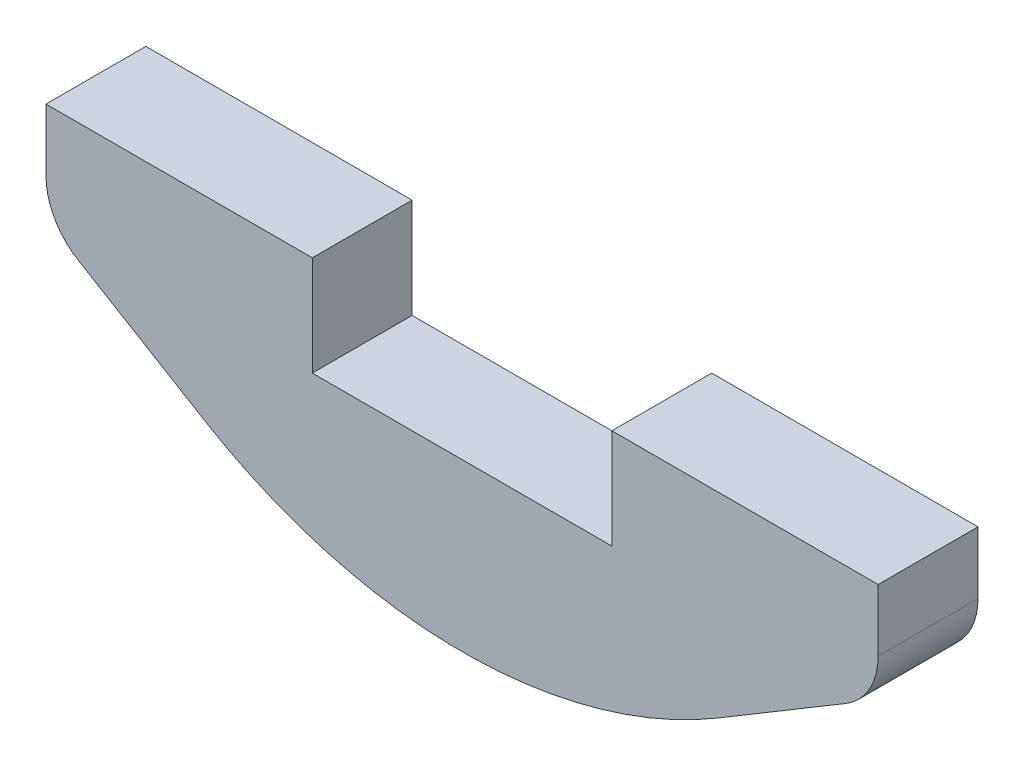
ISO-10303-21;
HEADER;
FILE_DESCRIPTION(('STEP AP214'),'2;1');
FILE_NAME('part.step','',(''),(''),'','','');
FILE_SCHEMA(('AUTOMOTIVE_DESIGN { 1 0 10303 214 1 1 1 1 }'));
ENDSEC;
DATA;
#1=APPLICATION_CONTEXT('core data for automotive mechanical design processes');
#2=APPLICATION_PROTOCOL_DEFINITION('international standard','automotive_design',2000,#1);
#3=PRODUCT_CONTEXT('',#1,'mechanical');
#4=PRODUCT('Part','Part','',(#3));
#5=PRODUCT_RELATED_PRODUCT_CATEGORY('part','',(#4));
#6=PRODUCT_DEFINITION_FORMATION('','',#4);
#7=PRODUCT_DEFINITION_CONTEXT('part definition',#1,'design');
#8=PRODUCT_DEFINITION('design','',#6,#7);
#9=PRODUCT_DEFINITION_SHAPE('','',#8);
#10=(LENGTH_UNIT() NAMED_UNIT(*) SI_UNIT(.MILLI.,.METRE.));
#11=(NAMED_UNIT(*) PLANE_ANGLE_UNIT() SI_UNIT($,.RADIAN.));
#12=(NAMED_UNIT(*) SI_UNIT($,.STERADIAN.) SOLID_ANGLE_UNIT());
#13=UNCERTAINTY_MEASURE_WITH_UNIT(LENGTH_MEASURE(1.E-05),#10,'distance_accuracy_value','');
#14=(GEOMETRIC_REPRESENTATION_CONTEXT(3) GLOBAL_UNCERTAINTY_ASSIGNED_CONTEXT((#13)) GLOBAL_UNIT_ASSIGNED_CONTEXT((#10,
#11,#12)) REPRESENTATION_CONTEXT('',''));
#15=CARTESIAN_POINT('',(0.,0.,0.));
#16=DIRECTION('',(0.,0.,1.));
#17=DIRECTION('',(1.,0.,0.));
#18=AXIS2_PLACEMENT_3D('',#15,#16,#17);
#19=CARTESIAN_POINT('',(-3.29672579863213,-5.50823669530776,3.));
#20=DIRECTION('',(0.513554343658557,0.858057070426804,0.));
#21=DIRECTION('',(-0.858057070426804,0.513554343658557,0.));
#22=AXIS2_PLACEMENT_3D('',#19,#20,#21);
#23=PLANE('',#22);
#24=DIRECTION('',(0.858057070426804,-0.513554343658557,0.));
#25=VECTOR('',#24,1.);
#26=CARTESIAN_POINT('',(-3.29672579863213,-5.50823669530776,3.));
#27=LINE('',#26,#25);
#28=CARTESIAN_POINT('',(-11.5271086873171,-0.582283599490007,3.));
#29=VERTEX_POINT('',#28);
#30=CARTESIAN_POINT('',(-7.70331515487836,-2.87085605640205,3.));
#31=VERTEX_POINT('',#30);
#32=EDGE_CURVE('E121',#29,#31,#27,.T.);
#33=ORIENTED_EDGE('',*,*,#32,.F.);
#34=DIRECTION('',(0.,0.,-1.));
#35=VECTOR('',#34,1.);
#36=CARTESIAN_POINT('',(-11.5271086873171,-0.582283599490008,0.));
#37=LINE('',#36,#35);
#38=CARTESIAN_POINT('',(-11.5271086873171,-0.582283599490007,0.));
#39=VERTEX_POINT('',#38);
#40=EDGE_CURVE('E43',#29,#39,#37,.T.);
#41=ORIENTED_EDGE('',*,*,#40,.T.);
#42=DIRECTION('',(0.858057070426804,-0.513554343658557,0.));
#43=VECTOR('',#42,1.);
#44=CARTESIAN_POINT('',(-3.29672579863213,-5.50823669530776,0.));
#45=LINE('',#44,#43);
#46=CARTESIAN_POINT('',(-7.70331515487836,-2.87085605640205,0.));
#47=VERTEX_POINT('',#46);
#48=EDGE_CURVE('E143',#39,#47,#45,.T.);
#49=ORIENTED_EDGE('',*,*,#48,.T.);
#50=DIRECTION('',(0.,0.,-1.));
#51=VECTOR('',#50,1.);
#52=CARTESIAN_POINT('',(-7.70331515487836,-2.87085605640205,3.));
#53=LINE('',#52,#51);
#54=EDGE_CURVE('E137',#31,#47,#53,.T.);
#55=ORIENTED_EDGE('',*,*,#54,.F.);
#56=EDGE_LOOP('',(#33,#41,#49,#55));
#57=FACE_BOUND('',#56,.T.);
#58=ADVANCED_FACE('F35',(#57),#23,.F.);
#59=CARTESIAN_POINT('',(0.,10.,3.));
#60=DIRECTION('',(0.,0.,-1.));
#61=DIRECTION('',(-1.,0.,0.));
#62=AXIS2_PLACEMENT_3D('',#59,#60,#61);
#63=CYLINDRICAL_SURFACE('',#62,15.);
#64=CARTESIAN_POINT('',(0.,10.,0.));
#65=DIRECTION('',(0.,0.,1.));
#66=DIRECTION('',(1.,0.,0.));
#67=AXIS2_PLACEMENT_3D('',#64,#65,#66);
#68=CIRCLE('',#67,15.);
#69=CARTESIAN_POINT('',(7.70331515487836,-2.87085605640205,0.));
#70=VERTEX_POINT('',#69);
#71=EDGE_CURVE('E165',#47,#70,#68,.T.);
#72=ORIENTED_EDGE('',*,*,#71,.T.);
#73=DIRECTION('',(0.,0.,-1.));
#74=VECTOR('',#73,1.);
#75=CARTESIAN_POINT('',(7.70331515487836,-2.87085605640205,3.));
#76=LINE('',#75,#74);
#77=CARTESIAN_POINT('',(7.70331515487836,-2.87085605640205,3.));
#78=VERTEX_POINT('',#77);
#79=EDGE_CURVE('E139',#78,#70,#76,.T.);
#80=ORIENTED_EDGE('',*,*,#79,.F.);
#81=CARTESIAN_POINT('',(0.,10.,3.));
#82=DIRECTION('',(0.,0.,1.));
#83=DIRECTION('',(1.,0.,0.));
#84=AXIS2_PLACEMENT_3D('',#81,#82,#83);
#85=CIRCLE('',#84,15.);
#86=EDGE_CURVE('E125',#31,#78,#85,.T.);
#87=ORIENTED_EDGE('',*,*,#86,.F.);
#88=ORIENTED_EDGE('',*,*,#54,.T.);
#89=EDGE_LOOP('',(#72,#80,#87,#88));
#90=FACE_BOUND('',#89,.T.);
#91=ADVANCED_FACE('F136',(#90),#63,.T.);
#92=CARTESIAN_POINT('',(3.29672579863213,-5.50823669530776,3.));
#93=DIRECTION('',(0.513554343658556,-0.858057070426804,0.));
#94=DIRECTION('',(0.858057070426804,0.513554343658556,0.));
#95=AXIS2_PLACEMENT_3D('',#92,#93,#94);
#96=PLANE('',#95);
#97=DIRECTION('',(-0.858057070426804,-0.513554343658556,0.));
#98=VECTOR('',#97,1.);
#99=CARTESIAN_POINT('',(3.29672579863213,-5.50823669530776,0.));
#100=LINE('',#99,#98);
#101=CARTESIAN_POINT('',(11.5271086873171,-0.582283599490009,0.));
#102=VERTEX_POINT('',#101);
#103=EDGE_CURVE('E167',#102,#70,#100,.T.);
#104=ORIENTED_EDGE('',*,*,#103,.F.);
#105=DIRECTION('',(0.,0.,-1.));
#106=VECTOR('',#105,1.);
#107=CARTESIAN_POINT('',(11.5271086873171,-0.582283599490009,3.));
#108=LINE('',#107,#106);
#109=CARTESIAN_POINT('',(11.5271086873171,-0.582283599490009,3.));
#110=VERTEX_POINT('',#109);
#111=EDGE_CURVE('E157',#102,#110,#108,.F.);
#112=ORIENTED_EDGE('',*,*,#111,.T.);
#113=DIRECTION('',(-0.858057070426804,-0.513554343658556,0.));
#114=VECTOR('',#113,1.);
#115=CARTESIAN_POINT('',(3.29672579863213,-5.50823669530776,3.));
#116=LINE('',#115,#114);
#117=EDGE_CURVE('E140',#110,#78,#116,.T.);
#118=ORIENTED_EDGE('',*,*,#117,.T.);
#119=ORIENTED_EDGE('',*,*,#79,.T.);
#120=EDGE_LOOP('',(#104,#112,#118,#119));
#121=FACE_BOUND('',#120,.T.);
#122=ADVANCED_FACE('F253',(#121),#96,.T.);
#123=CARTESIAN_POINT('',(12.5,0.,3.));
#124=DIRECTION('',(-1.,0.,0.));
#125=DIRECTION('',(0.,0.,1.));
#126=AXIS2_PLACEMENT_3D('',#123,#124,#125);
#127=PLANE('',#126);
#128=DIRECTION('',(0.,1.,0.));
#129=VECTOR('',#128,1.);
#130=CARTESIAN_POINT('',(12.5,0.,3.));
#131=LINE('',#130,#129);
#132=CARTESIAN_POINT('',(12.5,1.1338305413636,3.));
#133=VERTEX_POINT('',#132);
#134=CARTESIAN_POINT('',(12.5,3.,3.));
#135=VERTEX_POINT('',#134);
#136=EDGE_CURVE('E226',#133,#135,#131,.T.);
#137=ORIENTED_EDGE('',*,*,#136,.F.);
#138=DIRECTION('',(0.,0.,-1.));
#139=VECTOR('',#138,1.);
#140=CARTESIAN_POINT('',(12.5,1.1338305413636,0.));
#141=LINE('',#140,#139);
#142=CARTESIAN_POINT('',(12.5,1.1338305413636,0.));
#143=VERTEX_POINT('',#142);
#144=EDGE_CURVE('E145',#133,#143,#141,.T.);
#145=ORIENTED_EDGE('',*,*,#144,.T.);
#146=DIRECTION('',(0.,1.,0.));
#147=VECTOR('',#146,1.);
#148=CARTESIAN_POINT('',(12.5,0.,0.));
#149=LINE('',#148,#147);
#150=CARTESIAN_POINT('',(12.5,3.,0.));
#151=VERTEX_POINT('',#150);
#152=EDGE_CURVE('E174',#143,#151,#149,.T.);
#153=ORIENTED_EDGE('',*,*,#152,.T.);
#154=DIRECTION('',(0.,0.,-1.));
#155=VECTOR('',#154,1.);
#156=CARTESIAN_POINT('',(12.5,3.,3.));
#157=LINE('',#156,#155);
#158=EDGE_CURVE('E150',#135,#151,#157,.T.);
#159=ORIENTED_EDGE('',*,*,#158,.F.);
#160=EDGE_LOOP('',(#137,#145,#153,#159));
#161=FACE_BOUND('',#160,.T.);
#162=ADVANCED_FACE('F258',(#161),#127,.F.);
#163=CARTESIAN_POINT('',(0.,3.,3.));
#164=DIRECTION('',(0.,-1.,0.));
#165=DIRECTION('',(1.,0.,0.));
#166=AXIS2_PLACEMENT_3D('',#163,#164,#165);
#167=PLANE('',#166);
#168=DIRECTION('',(-1.,0.,0.));
#169=VECTOR('',#168,1.);
#170=CARTESIAN_POINT('',(0.,3.,0.));
#171=LINE('',#170,#169);
#172=CARTESIAN_POINT('',(4.5,3.,0.));
#173=VERTEX_POINT('',#172);
#174=EDGE_CURVE('E176',#151,#173,#171,.T.);
#175=ORIENTED_EDGE('',*,*,#174,.T.);
#176=DIRECTION('',(0.,0.,-1.));
#177=VECTOR('',#176,1.);
#178=CARTESIAN_POINT('',(4.5,3.,3.));
#179=LINE('',#178,#177);
#180=CARTESIAN_POINT('',(4.5,3.,3.));
#181=VERTEX_POINT('',#180);
#182=EDGE_CURVE('E201',#181,#173,#179,.T.);
#183=ORIENTED_EDGE('',*,*,#182,.F.);
#184=DIRECTION('',(-1.,0.,0.));
#185=VECTOR('',#184,1.);
#186=CARTESIAN_POINT('',(0.,3.,3.));
#187=LINE('',#186,#185);
#188=EDGE_CURVE('E209',#135,#181,#187,.T.);
#189=ORIENTED_EDGE('',*,*,#188,.F.);
#190=ORIENTED_EDGE('',*,*,#158,.T.);
#191=EDGE_LOOP('',(#175,#183,#189,#190));
#192=FACE_BOUND('',#191,.T.);
#193=ADVANCED_FACE('F207',(#192),#167,.F.);
#194=CARTESIAN_POINT('',(4.5,0.,3.));
#195=DIRECTION('',(-1.,0.,0.));
#196=DIRECTION('',(0.,0.,1.));
#197=AXIS2_PLACEMENT_3D('',#194,#195,#196);
#198=PLANE('',#197);
#199=DIRECTION('',(0.,1.,0.));
#200=VECTOR('',#199,1.);
#201=CARTESIAN_POINT('',(4.5,0.,0.));
#202=LINE('',#201,#200);
#203=CARTESIAN_POINT('',(4.5,0.,0.));
#204=VERTEX_POINT('',#203);
#205=EDGE_CURVE('E179',#204,#173,#202,.T.);
#206=ORIENTED_EDGE('',*,*,#205,.F.);
#207=DIRECTION('',(0.,0.,-1.));
#208=VECTOR('',#207,1.);
#209=CARTESIAN_POINT('',(4.5,0.,3.));
#210=LINE('',#209,#208);
#211=CARTESIAN_POINT('',(4.5,0.,3.));
#212=VERTEX_POINT('',#211);
#213=EDGE_CURVE('E199',#212,#204,#210,.T.);
#214=ORIENTED_EDGE('',*,*,#213,.F.);
#215=DIRECTION('',(0.,1.,0.));
#216=VECTOR('',#215,1.);
#217=CARTESIAN_POINT('',(4.5,0.,3.));
#218=LINE('',#217,#216);
#219=EDGE_CURVE('E219',#212,#181,#218,.T.);
#220=ORIENTED_EDGE('',*,*,#219,.T.);
#221=ORIENTED_EDGE('',*,*,#182,.T.);
#222=EDGE_LOOP('',(#206,#214,#220,#221));
#223=FACE_BOUND('',#222,.T.);
#224=ADVANCED_FACE('F216',(#223),#198,.T.);
#225=CARTESIAN_POINT('',(0.,0.,3.));
#226=DIRECTION('',(0.,1.,0.));
#227=DIRECTION('',(0.,0.,1.));
#228=AXIS2_PLACEMENT_3D('',#225,#226,#227);
#229=PLANE('',#228);
#230=DIRECTION('',(1.,0.,0.));
#231=VECTOR('',#230,1.);
#232=CARTESIAN_POINT('',(0.,0.,0.));
#233=LINE('',#232,#231);
#234=CARTESIAN_POINT('',(-4.5,0.,0.));
#235=VERTEX_POINT('',#234);
#236=EDGE_CURVE('E182',#235,#204,#233,.T.);
#237=ORIENTED_EDGE('',*,*,#236,.F.);
#238=DIRECTION('',(0.,0.,-1.));
#239=VECTOR('',#238,1.);
#240=CARTESIAN_POINT('',(-4.5,0.,3.));
#241=LINE('',#240,#239);
#242=CARTESIAN_POINT('',(-4.5,0.,3.));
#243=VERTEX_POINT('',#242);
#244=EDGE_CURVE('E197',#243,#235,#241,.T.);
#245=ORIENTED_EDGE('',*,*,#244,.F.);
#246=DIRECTION('',(1.,0.,0.));
#247=VECTOR('',#246,1.);
#248=CARTESIAN_POINT('',(0.,0.,3.));
#249=LINE('',#248,#247);
#250=EDGE_CURVE('E222',#243,#212,#249,.T.);
#251=ORIENTED_EDGE('',*,*,#250,.T.);
#252=ORIENTED_EDGE('',*,*,#213,.T.);
#253=EDGE_LOOP('',(#237,#245,#251,#252));
#254=FACE_BOUND('',#253,.T.);
#255=ADVANCED_FACE('F266',(#254),#229,.T.);
#256=CARTESIAN_POINT('',(-4.5,0.,3.));
#257=DIRECTION('',(-1.,0.,0.));
#258=DIRECTION('',(0.,0.,1.));
#259=AXIS2_PLACEMENT_3D('',#256,#257,#258);
#260=PLANE('',#259);
#261=DIRECTION('',(0.,1.,0.));
#262=VECTOR('',#261,1.);
#263=CARTESIAN_POINT('',(-4.5,0.,0.));
#264=LINE('',#263,#262);
#265=CARTESIAN_POINT('',(-4.5,3.,0.));
#266=VERTEX_POINT('',#265);
#267=EDGE_CURVE('E185',#235,#266,#264,.T.);
#268=ORIENTED_EDGE('',*,*,#267,.T.);
#269=DIRECTION('',(0.,0.,-1.));
#270=VECTOR('',#269,1.);
#271=CARTESIAN_POINT('',(-4.5,3.,3.));
#272=LINE('',#271,#270);
#273=CARTESIAN_POINT('',(-4.5,3.,3.));
#274=VERTEX_POINT('',#273);
#275=EDGE_CURVE('E195',#274,#266,#272,.T.);
#276=ORIENTED_EDGE('',*,*,#275,.F.);
#277=DIRECTION('',(0.,1.,0.));
#278=VECTOR('',#277,1.);
#279=CARTESIAN_POINT('',(-4.5,0.,3.));
#280=LINE('',#279,#278);
#281=EDGE_CURVE('E224',#243,#274,#280,.T.);
#282=ORIENTED_EDGE('',*,*,#281,.F.);
#283=ORIENTED_EDGE('',*,*,#244,.T.);
#284=EDGE_LOOP('',(#268,#276,#282,#283));
#285=FACE_BOUND('',#284,.T.);
#286=ADVANCED_FACE('F241',(#285),#260,.F.);
#287=CARTESIAN_POINT('',(0.,3.,3.));
#288=DIRECTION('',(0.,1.,0.));
#289=DIRECTION('',(0.,0.,1.));
#290=AXIS2_PLACEMENT_3D('',#287,#288,#289);
#291=PLANE('',#290);
#292=DIRECTION('',(1.,0.,0.));
#293=VECTOR('',#292,1.);
#294=CARTESIAN_POINT('',(0.,3.,0.));
#295=LINE('',#294,#293);
#296=CARTESIAN_POINT('',(-12.5,3.,0.));
#297=VERTEX_POINT('',#296);
#298=EDGE_CURVE('E188',#297,#266,#295,.T.);
#299=ORIENTED_EDGE('',*,*,#298,.F.);
#300=DIRECTION('',(0.,0.,-1.));
#301=VECTOR('',#300,1.);
#302=CARTESIAN_POINT('',(-12.5,3.,3.));
#303=LINE('',#302,#301);
#304=CARTESIAN_POINT('',(-12.5,3.,3.));
#305=VERTEX_POINT('',#304);
#306=EDGE_CURVE('E192',#305,#297,#303,.T.);
#307=ORIENTED_EDGE('',*,*,#306,.F.);
#308=DIRECTION('',(1.,0.,0.));
#309=VECTOR('',#308,1.);
#310=CARTESIAN_POINT('',(0.,3.,3.));
#311=LINE('',#310,#309);
#312=EDGE_CURVE('E230',#305,#274,#311,.T.);
#313=ORIENTED_EDGE('',*,*,#312,.T.);
#314=ORIENTED_EDGE('',*,*,#275,.T.);
#315=EDGE_LOOP('',(#299,#307,#313,#314));
#316=FACE_BOUND('',#315,.T.);
#317=ADVANCED_FACE('F237',(#316),#291,.T.);
#318=CARTESIAN_POINT('',(-12.5,0.,3.));
#319=DIRECTION('',(-1.,0.,0.));
#320=DIRECTION('',(0.,0.,1.));
#321=AXIS2_PLACEMENT_3D('',#318,#319,#320);
#322=PLANE('',#321);
#323=DIRECTION('',(0.,1.,0.));
#324=VECTOR('',#323,1.);
#325=CARTESIAN_POINT('',(-12.5,0.,0.));
#326=LINE('',#325,#324);
#327=CARTESIAN_POINT('',(-12.5,1.1338305413636,0.));
#328=VERTEX_POINT('',#327);
#329=EDGE_CURVE('E131',#328,#297,#326,.T.);
#330=ORIENTED_EDGE('',*,*,#329,.F.);
#331=DIRECTION('',(0.,0.,-1.));
#332=VECTOR('',#331,1.);
#333=CARTESIAN_POINT('',(-12.5,1.1338305413636,3.));
#334=LINE('',#333,#332);
#335=CARTESIAN_POINT('',(-12.5,1.1338305413636,3.));
#336=VERTEX_POINT('',#335);
#337=EDGE_CURVE('E11',#328,#336,#334,.F.);
#338=ORIENTED_EDGE('',*,*,#337,.T.);
#339=DIRECTION('',(0.,1.,0.));
#340=VECTOR('',#339,1.);
#341=CARTESIAN_POINT('',(-12.5,0.,3.));
#342=LINE('',#341,#340);
#343=EDGE_CURVE('E170',#336,#305,#342,.T.);
#344=ORIENTED_EDGE('',*,*,#343,.T.);
#345=ORIENTED_EDGE('',*,*,#306,.T.);
#346=EDGE_LOOP('',(#330,#338,#344,#345));
#347=FACE_BOUND('',#346,.T.);
#348=ADVANCED_FACE('F235',(#347),#322,.T.);
#349=CARTESIAN_POINT('',(0.,0.,3.));
#350=DIRECTION('',(0.,0.,1.));
#351=DIRECTION('',(1.,0.,0.));
#352=AXIS2_PLACEMENT_3D('',#349,#350,#351);
#353=PLANE('',#352);
#354=ORIENTED_EDGE('',*,*,#117,.F.);
#355=CARTESIAN_POINT('',(10.5,1.1338305413636,3.));
#356=DIRECTION('',(0.,0.,1.));
#357=DIRECTION('',(1.,0.,0.));
#358=AXIS2_PLACEMENT_3D('',#355,#356,#357);
#359=CIRCLE('',#358,2.);
#360=EDGE_CURVE('E160',#110,#133,#359,.T.);
#361=ORIENTED_EDGE('',*,*,#360,.T.);
#362=ORIENTED_EDGE('',*,*,#136,.T.);
#363=ORIENTED_EDGE('',*,*,#188,.T.);
#364=ORIENTED_EDGE('',*,*,#219,.F.);
#365=ORIENTED_EDGE('',*,*,#250,.F.);
#366=ORIENTED_EDGE('',*,*,#281,.T.);
#367=ORIENTED_EDGE('',*,*,#312,.F.);
#368=ORIENTED_EDGE('',*,*,#343,.F.);
#369=CARTESIAN_POINT('',(-10.5,1.1338305413636,3.));
#370=DIRECTION('',(0.,0.,1.));
#371=DIRECTION('',(1.,0.,0.));
#372=AXIS2_PLACEMENT_3D('',#369,#370,#371);
#373=CIRCLE('',#372,2.);
#374=EDGE_CURVE('E55',#336,#29,#373,.T.);
#375=ORIENTED_EDGE('',*,*,#374,.T.);
#376=ORIENTED_EDGE('',*,*,#32,.T.);
#377=ORIENTED_EDGE('',*,*,#86,.T.);
#378=EDGE_LOOP('',(#354,#361,#362,#363,#364,#365,#366,#367,#368,#375,#376,#377));
#379=FACE_BOUND('',#378,.T.);
#380=ADVANCED_FACE('F124',(#379),#353,.T.);
#381=CARTESIAN_POINT('',(0.,0.,0.));
#382=DIRECTION('',(0.,0.,1.));
#383=DIRECTION('',(1.,0.,0.));
#384=AXIS2_PLACEMENT_3D('',#381,#382,#383);
#385=PLANE('',#384);
#386=ORIENTED_EDGE('',*,*,#152,.F.);
#387=CARTESIAN_POINT('',(10.5,1.1338305413636,0.));
#388=DIRECTION('',(0.,0.,1.));
#389=DIRECTION('',(1.,0.,0.));
#390=AXIS2_PLACEMENT_3D('',#387,#388,#389);
#391=CIRCLE('',#390,2.);
#392=EDGE_CURVE('E155',#143,#102,#391,.F.);
#393=ORIENTED_EDGE('',*,*,#392,.T.);
#394=ORIENTED_EDGE('',*,*,#103,.T.);
#395=ORIENTED_EDGE('',*,*,#71,.F.);
#396=ORIENTED_EDGE('',*,*,#48,.F.);
#397=CARTESIAN_POINT('',(-10.5,1.1338305413636,0.));
#398=DIRECTION('',(0.,0.,1.));
#399=DIRECTION('',(1.,0.,0.));
#400=AXIS2_PLACEMENT_3D('',#397,#398,#399);
#401=CIRCLE('',#400,2.);
#402=EDGE_CURVE('E148',#39,#328,#401,.F.);
#403=ORIENTED_EDGE('',*,*,#402,.T.);
#404=ORIENTED_EDGE('',*,*,#329,.T.);
#405=ORIENTED_EDGE('',*,*,#298,.T.);
#406=ORIENTED_EDGE('',*,*,#267,.F.);
#407=ORIENTED_EDGE('',*,*,#236,.T.);
#408=ORIENTED_EDGE('',*,*,#205,.T.);
#409=ORIENTED_EDGE('',*,*,#174,.F.);
#410=EDGE_LOOP('',(#386,#393,#394,#395,#396,#403,#404,#405,#406,#407,#408,#409));
#411=FACE_BOUND('',#410,.T.);
#412=ADVANCED_FACE('F164',(#411),#385,.F.);
#413=CARTESIAN_POINT('',(10.5,1.1338305413636,3.));
#414=DIRECTION('',(0.,0.,1.));
#415=DIRECTION('',(1.,0.,0.));
#416=AXIS2_PLACEMENT_3D('',#413,#414,#415);
#417=CYLINDRICAL_SURFACE('',#416,2.);
#418=ORIENTED_EDGE('',*,*,#360,.F.);
#419=ORIENTED_EDGE('',*,*,#111,.F.);
#420=ORIENTED_EDGE('',*,*,#392,.F.);
#421=ORIENTED_EDGE('',*,*,#144,.F.);
#422=EDGE_LOOP('',(#418,#419,#420,#421));
#423=FACE_BOUND('',#422,.T.);
#424=ADVANCED_FACE('F243',(#423),#417,.T.);
#425=CARTESIAN_POINT('',(-10.5,1.1338305413636,3.));
#426=DIRECTION('',(0.,0.,1.));
#427=DIRECTION('',(1.,0.,0.));
#428=AXIS2_PLACEMENT_3D('',#425,#426,#427);
#429=CYLINDRICAL_SURFACE('',#428,2.);
#430=ORIENTED_EDGE('',*,*,#374,.F.);
#431=ORIENTED_EDGE('',*,*,#337,.F.);
#432=ORIENTED_EDGE('',*,*,#402,.F.);
#433=ORIENTED_EDGE('',*,*,#40,.F.);
#434=EDGE_LOOP('',(#430,#431,#432,#433));
#435=FACE_BOUND('',#434,.T.);
#436=ADVANCED_FACE('F37',(#435),#429,.T.);
#437=CLOSED_SHELL('',(#58,#91,#122,#162,#193,#224,#255,#286,#317,#348,#380,#412,#424,#436));
#438=MANIFOLD_SOLID_BREP('B2',#437);
#439=ADVANCED_BREP_SHAPE_REPRESENTATION('',(#18,#438),#14);
#440=SHAPE_DEFINITION_REPRESENTATION(#9,#439);
ENDSEC;
END-ISO-10303-21;
